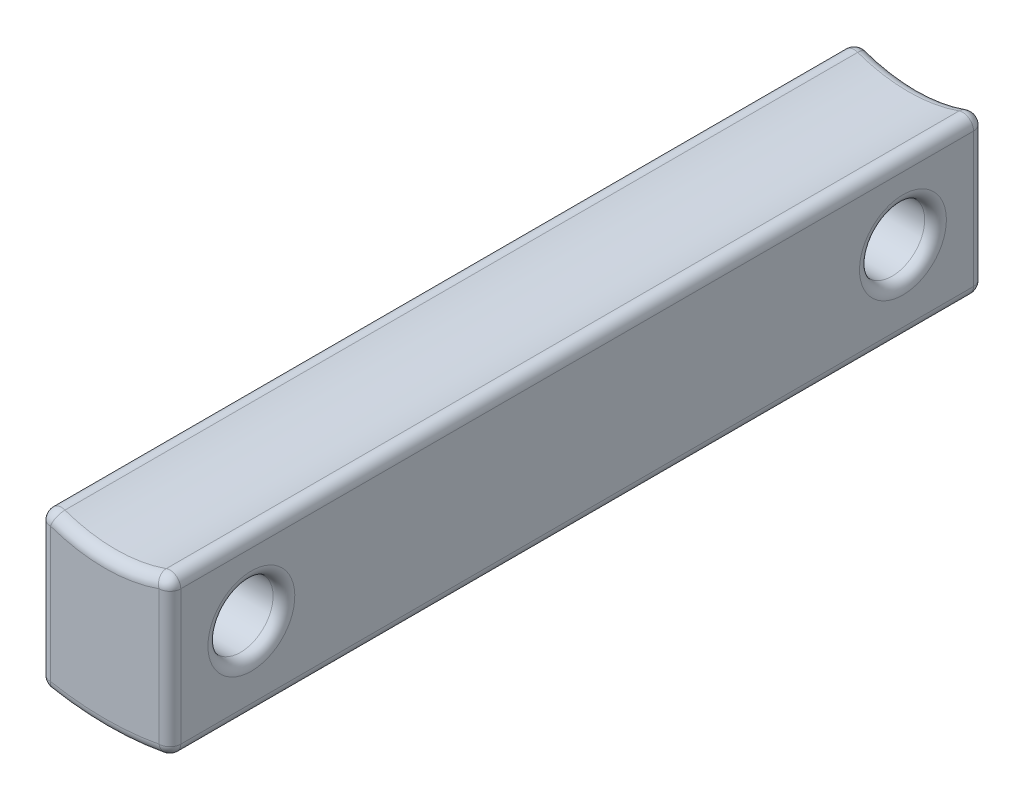
ISO-10303-21;
HEADER;
FILE_DESCRIPTION(('STEP AP214'),'2;1');
FILE_NAME('part.step','',(''),(''),'','','');
FILE_SCHEMA(('AUTOMOTIVE_DESIGN { 1 0 10303 214 1 1 1 1 }'));
ENDSEC;
DATA;
#1=APPLICATION_CONTEXT('core data for automotive mechanical design processes');
#2=APPLICATION_PROTOCOL_DEFINITION('international standard','automotive_design',2000,#1);
#3=PRODUCT_CONTEXT('',#1,'mechanical');
#4=PRODUCT('Part','Part','',(#3));
#5=PRODUCT_RELATED_PRODUCT_CATEGORY('part','',(#4));
#6=PRODUCT_DEFINITION_FORMATION('','',#4);
#7=PRODUCT_DEFINITION_CONTEXT('part definition',#1,'design');
#8=PRODUCT_DEFINITION('design','',#6,#7);
#9=PRODUCT_DEFINITION_SHAPE('','',#8);
#10=(LENGTH_UNIT() NAMED_UNIT(*) SI_UNIT(.MILLI.,.METRE.));
#11=(NAMED_UNIT(*) PLANE_ANGLE_UNIT() SI_UNIT($,.RADIAN.));
#12=(NAMED_UNIT(*) SI_UNIT($,.STERADIAN.) SOLID_ANGLE_UNIT());
#13=UNCERTAINTY_MEASURE_WITH_UNIT(LENGTH_MEASURE(1.E-05),#10,'distance_accuracy_value','');
#14=(GEOMETRIC_REPRESENTATION_CONTEXT(3) GLOBAL_UNCERTAINTY_ASSIGNED_CONTEXT((#13)) GLOBAL_UNIT_ASSIGNED_CONTEXT((#10,
#11,#12)) REPRESENTATION_CONTEXT('',''));
#15=CARTESIAN_POINT('',(0.,0.,0.));
#16=DIRECTION('',(0.,0.,1.));
#17=DIRECTION('',(1.,0.,0.));
#18=AXIS2_PLACEMENT_3D('',#15,#16,#17);
#19=CARTESIAN_POINT('',(-7.74395898966472,15.9123081045218,37.5));
#20=DIRECTION('',(0.,0.,-1.));
#21=DIRECTION('',(-1.,0.,0.));
#22=AXIS2_PLACEMENT_3D('',#19,#20,#21);
#23=CYLINDRICAL_SURFACE('',#22,14.);
#24=CARTESIAN_POINT('',(-7.74395898966472,15.9123081045218,36.5));
#25=DIRECTION('',(0.,0.,1.));
#26=DIRECTION('',(1.,0.,0.));
#27=AXIS2_PLACEMENT_3D('',#24,#25,#26);
#28=CIRCLE('',#27,14.);
#29=CARTESIAN_POINT('',(-12.4106256563314,2.71298152237291,36.5));
#30=VERTEX_POINT('',#29);
#31=CARTESIAN_POINT('',(-3.07729232299805,2.71298152237291,36.5));
#32=VERTEX_POINT('',#31);
#33=EDGE_CURVE('E49',#30,#32,#28,.T.);
#34=ORIENTED_EDGE('',*,*,#33,.T.);
#35=DIRECTION('',(0.,0.,-1.));
#36=VECTOR('',#35,1.);
#37=CARTESIAN_POINT('',(-3.07729232299805,2.71298152237291,37.5));
#38=LINE('',#37,#36);
#39=CARTESIAN_POINT('',(-3.07729232299805,2.71298152237291,-36.5));
#40=VERTEX_POINT('',#39);
#41=EDGE_CURVE('E11',#32,#40,#38,.T.);
#42=ORIENTED_EDGE('',*,*,#41,.T.);
#43=CARTESIAN_POINT('',(-7.74395898966472,15.9123081045218,-36.5));
#44=DIRECTION('',(0.,0.,1.));
#45=DIRECTION('',(1.,0.,0.));
#46=AXIS2_PLACEMENT_3D('',#43,#44,#45);
#47=CIRCLE('',#46,14.);
#48=CARTESIAN_POINT('',(-12.4106256563314,2.71298152237291,-36.5));
#49=VERTEX_POINT('',#48);
#50=EDGE_CURVE('E247',#40,#49,#47,.F.);
#51=ORIENTED_EDGE('',*,*,#50,.T.);
#52=DIRECTION('',(0.,0.,-1.));
#53=VECTOR('',#52,1.);
#54=CARTESIAN_POINT('',(-12.4106256563314,2.71298152237291,37.5));
#55=LINE('',#54,#53);
#56=EDGE_CURVE('E60',#49,#30,#55,.F.);
#57=ORIENTED_EDGE('',*,*,#56,.T.);
#58=EDGE_LOOP('',(#34,#42,#51,#57));
#59=FACE_BOUND('',#58,.T.);
#60=ADVANCED_FACE('F39',(#59),#23,.F.);
#61=CARTESIAN_POINT('',(-13.7439589896647,3.26319746384829,37.5));
#62=DIRECTION('',(1.,0.,0.));
#63=DIRECTION('',(0.,0.,-1.));
#64=AXIS2_PLACEMENT_3D('',#61,#62,#63);
#65=PLANE('',#64);
#66=DIRECTION('',(0.,-1.,0.));
#67=VECTOR('',#66,1.);
#68=CARTESIAN_POINT('',(-13.7439589896647,3.26319746384829,-36.5));
#69=LINE('',#68,#67);
#70=CARTESIAN_POINT('',(-13.7439589896647,1.77017248079085,-36.5));
#71=VERTEX_POINT('',#70);
#72=CARTESIAN_POINT('',(-13.7439589896647,-10.6206902183214,-36.5));
#73=VERTEX_POINT('',#72);
#74=EDGE_CURVE('E184',#71,#73,#69,.T.);
#75=ORIENTED_EDGE('',*,*,#74,.T.);
#76=DIRECTION('',(0.,0.,-1.));
#77=VECTOR('',#76,1.);
#78=CARTESIAN_POINT('',(-13.7439589896647,-10.6206902183214,37.5));
#79=LINE('',#78,#77);
#80=CARTESIAN_POINT('',(-13.7439589896647,-10.6206902183214,36.5));
#81=VERTEX_POINT('',#80);
#82=EDGE_CURVE('E191',#73,#81,#79,.F.);
#83=ORIENTED_EDGE('',*,*,#82,.T.);
#84=DIRECTION('',(0.,-1.,0.));
#85=VECTOR('',#84,1.);
#86=CARTESIAN_POINT('',(-13.7439589896647,3.26319746384829,36.5));
#87=LINE('',#86,#85);
#88=CARTESIAN_POINT('',(-13.7439589896647,1.77017248079085,36.5));
#89=VERTEX_POINT('',#88);
#90=EDGE_CURVE('E187',#81,#89,#87,.F.);
#91=ORIENTED_EDGE('',*,*,#90,.T.);
#92=DIRECTION('',(0.,0.,-1.));
#93=VECTOR('',#92,1.);
#94=CARTESIAN_POINT('',(-13.7439589896647,1.77017248079085,37.5));
#95=LINE('',#94,#93);
#96=EDGE_CURVE('E181',#89,#71,#95,.T.);
#97=ORIENTED_EDGE('',*,*,#96,.T.);
#98=EDGE_LOOP('',(#75,#83,#91,#97));
#99=FACE_BOUND('',#98,.T.);
#100=CARTESIAN_POINT('',(-13.7439589896647,-4.05206194308302,30.));
#101=DIRECTION('',(-1.,0.,0.));
#102=DIRECTION('',(0.,0.,1.));
#103=AXIS2_PLACEMENT_3D('',#100,#101,#102);
#104=CIRCLE('',#103,3.);
#105=CARTESIAN_POINT('',(-13.7439589896647,-4.05206194308302,33.));
#106=VERTEX_POINT('',#105);
#107=EDGE_CURVE('E169',#106,#106,#104,.T.);
#108=ORIENTED_EDGE('',*,*,#107,.F.);
#109=EDGE_LOOP('',(#108));
#110=FACE_BOUND('',#109,.T.);
#111=CARTESIAN_POINT('',(-13.7439589896647,-4.05206194308303,-30.));
#112=DIRECTION('',(-1.,0.,0.));
#113=DIRECTION('',(0.,0.,1.));
#114=AXIS2_PLACEMENT_3D('',#111,#112,#113);
#115=CIRCLE('',#114,3.);
#116=CARTESIAN_POINT('',(-13.7439589896647,-4.05206194308303,-27.));
#117=VERTEX_POINT('',#116);
#118=EDGE_CURVE('E173',#117,#117,#115,.T.);
#119=ORIENTED_EDGE('',*,*,#118,.F.);
#120=EDGE_LOOP('',(#119));
#121=FACE_BOUND('',#120,.T.);
#122=ADVANCED_FACE('F339',(#99,#110,#121),#65,.F.);
#123=CARTESIAN_POINT('',(-7.74395898966471,15.9123081045218,37.5));
#124=DIRECTION('',(0.,0.,-1.));
#125=DIRECTION('',(-1.,0.,0.));
#126=AXIS2_PLACEMENT_3D('',#123,#124,#125);
#127=CYLINDRICAL_SURFACE('',#126,28.);
#128=CARTESIAN_POINT('',(-7.74395898966471,15.9123081045218,36.5));
#129=DIRECTION('',(0.,0.,1.));
#130=DIRECTION('',(1.,0.,0.));
#131=AXIS2_PLACEMENT_3D('',#128,#129,#130);
#132=CIRCLE('',#131,28.);
#133=CARTESIAN_POINT('',(-2.55877380447953,-11.6033938599082,36.5));
#134=VERTEX_POINT('',#133);
#135=CARTESIAN_POINT('',(-12.9291441748499,-11.6033938599082,36.5));
#136=VERTEX_POINT('',#135);
#137=EDGE_CURVE('E240',#134,#136,#132,.F.);
#138=ORIENTED_EDGE('',*,*,#137,.T.);
#139=DIRECTION('',(0.,0.,-1.));
#140=VECTOR('',#139,1.);
#141=CARTESIAN_POINT('',(-12.9291441748499,-11.6033938599082,37.5));
#142=LINE('',#141,#140);
#143=CARTESIAN_POINT('',(-12.9291441748499,-11.6033938599082,-36.5));
#144=VERTEX_POINT('',#143);
#145=EDGE_CURVE('E243',#136,#144,#142,.T.);
#146=ORIENTED_EDGE('',*,*,#145,.T.);
#147=CARTESIAN_POINT('',(-7.74395898966471,15.9123081045218,-36.5));
#148=DIRECTION('',(0.,0.,1.));
#149=DIRECTION('',(1.,0.,0.));
#150=AXIS2_PLACEMENT_3D('',#147,#148,#149);
#151=CIRCLE('',#150,28.);
#152=CARTESIAN_POINT('',(-2.55877380447953,-11.6033938599082,-36.5));
#153=VERTEX_POINT('',#152);
#154=EDGE_CURVE('E234',#144,#153,#151,.T.);
#155=ORIENTED_EDGE('',*,*,#154,.T.);
#156=DIRECTION('',(0.,0.,-1.));
#157=VECTOR('',#156,1.);
#158=CARTESIAN_POINT('',(-2.55877380447953,-11.6033938599082,37.5));
#159=LINE('',#158,#157);
#160=EDGE_CURVE('E237',#153,#134,#159,.F.);
#161=ORIENTED_EDGE('',*,*,#160,.T.);
#162=EDGE_LOOP('',(#138,#146,#155,#161));
#163=FACE_BOUND('',#162,.T.);
#164=ADVANCED_FACE('F341',(#163),#127,.T.);
#165=CARTESIAN_POINT('',(-1.74395898966472,-11.4372805578329,37.5));
#166=DIRECTION('',(-1.,0.,0.));
#167=DIRECTION('',(0.,-1.,0.));
#168=AXIS2_PLACEMENT_3D('',#165,#166,#167);
#169=PLANE('',#168);
#170=CARTESIAN_POINT('',(-1.74395898966472,-4.05206194308303,-30.));
#171=DIRECTION('',(-1.,0.,0.));
#172=DIRECTION('',(0.,-1.,0.));
#173=AXIS2_PLACEMENT_3D('',#170,#171,#172);
#174=CIRCLE('',#173,4.);
#175=CARTESIAN_POINT('',(-1.74395898966472,-8.05206194308303,-30.));
#176=VERTEX_POINT('',#175);
#177=EDGE_CURVE('E209',#176,#176,#174,.T.);
#178=ORIENTED_EDGE('',*,*,#177,.T.);
#179=EDGE_LOOP('',(#178));
#180=FACE_BOUND('',#179,.T.);
#181=CARTESIAN_POINT('',(-1.74395898966472,-4.05206194308302,30.));
#182=DIRECTION('',(-1.,0.,0.));
#183=DIRECTION('',(0.,-1.,0.));
#184=AXIS2_PLACEMENT_3D('',#181,#182,#183);
#185=CIRCLE('',#184,4.);
#186=CARTESIAN_POINT('',(-1.74395898966472,-8.05206194308302,30.));
#187=VERTEX_POINT('',#186);
#188=EDGE_CURVE('E205',#187,#187,#185,.T.);
#189=ORIENTED_EDGE('',*,*,#188,.T.);
#190=EDGE_LOOP('',(#189));
#191=FACE_BOUND('',#190,.T.);
#192=DIRECTION('',(0.,1.,0.));
#193=VECTOR('',#192,1.);
#194=CARTESIAN_POINT('',(-1.74395898966472,-11.4372805578329,36.5));
#195=LINE('',#194,#193);
#196=CARTESIAN_POINT('',(-1.74395898966472,1.77017248079085,36.5));
#197=VERTEX_POINT('',#196);
#198=CARTESIAN_POINT('',(-1.74395898966472,-10.6206902183214,36.5));
#199=VERTEX_POINT('',#198);
#200=EDGE_CURVE('E148',#197,#199,#195,.F.);
#201=ORIENTED_EDGE('',*,*,#200,.T.);
#202=DIRECTION('',(0.,0.,-1.));
#203=VECTOR('',#202,1.);
#204=CARTESIAN_POINT('',(-1.74395898966472,-10.6206902183214,37.5));
#205=LINE('',#204,#203);
#206=CARTESIAN_POINT('',(-1.74395898966472,-10.6206902183214,-36.5));
#207=VERTEX_POINT('',#206);
#208=EDGE_CURVE('E202',#199,#207,#205,.T.);
#209=ORIENTED_EDGE('',*,*,#208,.T.);
#210=DIRECTION('',(0.,1.,0.));
#211=VECTOR('',#210,1.);
#212=CARTESIAN_POINT('',(-1.74395898966472,-11.4372805578329,-36.5));
#213=LINE('',#212,#211);
#214=CARTESIAN_POINT('',(-1.74395898966472,1.77017248079085,-36.5));
#215=VERTEX_POINT('',#214);
#216=EDGE_CURVE('E197',#207,#215,#213,.T.);
#217=ORIENTED_EDGE('',*,*,#216,.T.);
#218=DIRECTION('',(0.,0.,-1.));
#219=VECTOR('',#218,1.);
#220=CARTESIAN_POINT('',(-1.74395898966472,1.77017248079084,37.5));
#221=LINE('',#220,#219);
#222=EDGE_CURVE('E194',#215,#197,#221,.F.);
#223=ORIENTED_EDGE('',*,*,#222,.T.);
#224=EDGE_LOOP('',(#201,#209,#217,#223));
#225=FACE_BOUND('',#224,.T.);
#226=ADVANCED_FACE('F348',(#180,#191,#225),#169,.F.);
#227=CARTESIAN_POINT('',(-7.74395898966472,15.9123081045218,37.5));
#228=DIRECTION('',(0.,0.,1.));
#229=DIRECTION('',(1.,0.,0.));
#230=AXIS2_PLACEMENT_3D('',#227,#228,#229);
#231=PLANE('',#230);
#232=DIRECTION('',(0.,-1.,0.));
#233=VECTOR('',#232,1.);
#234=CARTESIAN_POINT('',(-12.7439589896647,-11.4372805578329,37.5));
#235=LINE('',#234,#233);
#236=CARTESIAN_POINT('',(-12.7439589896647,1.77017248079085,37.5));
#237=VERTEX_POINT('',#236);
#238=CARTESIAN_POINT('',(-12.7439589896647,-10.6206902183214,37.5));
#239=VERTEX_POINT('',#238);
#240=EDGE_CURVE('E140',#237,#239,#235,.T.);
#241=ORIENTED_EDGE('',*,*,#240,.T.);
#242=CARTESIAN_POINT('',(-7.74395898966471,15.9123081045218,37.5));
#243=DIRECTION('',(0.,0.,1.));
#244=DIRECTION('',(1.,0.,0.));
#245=AXIS2_PLACEMENT_3D('',#242,#243,#244);
#246=CIRCLE('',#245,27.);
#247=CARTESIAN_POINT('',(-2.74395898966472,-10.6206902183214,37.5));
#248=VERTEX_POINT('',#247);
#249=EDGE_CURVE('E135',#239,#248,#246,.T.);
#250=ORIENTED_EDGE('',*,*,#249,.T.);
#251=DIRECTION('',(0.,1.,0.));
#252=VECTOR('',#251,1.);
#253=CARTESIAN_POINT('',(-2.74395898966472,3.26319746384827,37.5));
#254=LINE('',#253,#252);
#255=CARTESIAN_POINT('',(-2.74395898966472,1.77017248079084,37.5));
#256=VERTEX_POINT('',#255);
#257=EDGE_CURVE('E127',#248,#256,#254,.T.);
#258=ORIENTED_EDGE('',*,*,#257,.T.);
#259=CARTESIAN_POINT('',(-7.74395898966472,15.9123081045218,37.5));
#260=DIRECTION('',(0.,0.,1.));
#261=DIRECTION('',(1.,0.,0.));
#262=AXIS2_PLACEMENT_3D('',#259,#260,#261);
#263=CIRCLE('',#262,15.);
#264=EDGE_CURVE('E132',#256,#237,#263,.F.);
#265=ORIENTED_EDGE('',*,*,#264,.T.);
#266=EDGE_LOOP('',(#241,#250,#258,#265));
#267=FACE_BOUND('',#266,.T.);
#268=ADVANCED_FACE('F130',(#267),#231,.T.);
#269=CARTESIAN_POINT('',(-7.74395898966472,15.9123081045218,-37.5));
#270=DIRECTION('',(0.,0.,1.));
#271=DIRECTION('',(1.,0.,0.));
#272=AXIS2_PLACEMENT_3D('',#269,#270,#271);
#273=PLANE('',#272);
#274=DIRECTION('',(0.,1.,0.));
#275=VECTOR('',#274,1.);
#276=CARTESIAN_POINT('',(-2.74395898966472,15.9123081045218,-37.5));
#277=LINE('',#276,#275);
#278=CARTESIAN_POINT('',(-2.74395898966472,1.77017248079084,-37.5));
#279=VERTEX_POINT('',#278);
#280=CARTESIAN_POINT('',(-2.74395898966472,-10.6206902183214,-37.5));
#281=VERTEX_POINT('',#280);
#282=EDGE_CURVE('E224',#279,#281,#277,.F.);
#283=ORIENTED_EDGE('',*,*,#282,.T.);
#284=CARTESIAN_POINT('',(-7.74395898966471,15.9123081045218,-37.5));
#285=DIRECTION('',(0.,0.,1.));
#286=DIRECTION('',(1.,0.,0.));
#287=AXIS2_PLACEMENT_3D('',#284,#285,#286);
#288=CIRCLE('',#287,27.);
#289=CARTESIAN_POINT('',(-12.7439589896647,-10.6206902183214,-37.5));
#290=VERTEX_POINT('',#289);
#291=EDGE_CURVE('E231',#281,#290,#288,.F.);
#292=ORIENTED_EDGE('',*,*,#291,.T.);
#293=DIRECTION('',(0.,-1.,0.));
#294=VECTOR('',#293,1.);
#295=CARTESIAN_POINT('',(-12.7439589896647,15.9123081045218,-37.5));
#296=LINE('',#295,#294);
#297=CARTESIAN_POINT('',(-12.7439589896647,1.77017248079085,-37.5));
#298=VERTEX_POINT('',#297);
#299=EDGE_CURVE('E227',#290,#298,#296,.F.);
#300=ORIENTED_EDGE('',*,*,#299,.T.);
#301=CARTESIAN_POINT('',(-7.74395898966472,15.9123081045218,-37.5));
#302=DIRECTION('',(0.,0.,1.));
#303=DIRECTION('',(1.,0.,0.));
#304=AXIS2_PLACEMENT_3D('',#301,#302,#303);
#305=CIRCLE('',#304,15.);
#306=EDGE_CURVE('E221',#298,#279,#305,.T.);
#307=ORIENTED_EDGE('',*,*,#306,.T.);
#308=EDGE_LOOP('',(#283,#292,#300,#307));
#309=FACE_BOUND('',#308,.T.);
#310=ADVANCED_FACE('F465',(#309),#273,.F.);
#311=CARTESIAN_POINT('',(-1.74395898966472,-4.05206194308303,-30.));
#312=DIRECTION('',(-1.,0.,0.));
#313=DIRECTION('',(0.,0.,1.));
#314=AXIS2_PLACEMENT_3D('',#311,#312,#313);
#315=CYLINDRICAL_SURFACE('',#314,3.);
#316=CARTESIAN_POINT('',(-2.74395898966472,-4.05206194308303,-30.));
#317=DIRECTION('',(-1.,0.,0.));
#318=DIRECTION('',(0.,-1.,0.));
#319=AXIS2_PLACEMENT_3D('',#316,#317,#318);
#320=CIRCLE('',#319,3.);
#321=CARTESIAN_POINT('',(-2.74395898966472,-7.05206194308303,-30.));
#322=VERTEX_POINT('',#321);
#323=EDGE_CURVE('E213',#322,#322,#320,.F.);
#324=ORIENTED_EDGE('',*,*,#323,.T.);
#325=EDGE_LOOP('',(#324));
#326=FACE_BOUND('',#325,.T.);
#327=ORIENTED_EDGE('',*,*,#118,.T.);
#328=EDGE_LOOP('',(#327));
#329=FACE_BOUND('',#328,.T.);
#330=ADVANCED_FACE('F337',(#326,#329),#315,.F.);
#331=CARTESIAN_POINT('',(-1.74395898966472,-4.05206194308302,30.));
#332=DIRECTION('',(-1.,0.,0.));
#333=DIRECTION('',(0.,0.,1.));
#334=AXIS2_PLACEMENT_3D('',#331,#332,#333);
#335=CYLINDRICAL_SURFACE('',#334,3.);
#336=CARTESIAN_POINT('',(-2.74395898966472,-4.05206194308302,30.));
#337=DIRECTION('',(-1.,0.,0.));
#338=DIRECTION('',(0.,-1.,0.));
#339=AXIS2_PLACEMENT_3D('',#336,#337,#338);
#340=CIRCLE('',#339,3.);
#341=CARTESIAN_POINT('',(-2.74395898966472,-7.05206194308302,30.));
#342=VERTEX_POINT('',#341);
#343=EDGE_CURVE('E217',#342,#342,#340,.F.);
#344=ORIENTED_EDGE('',*,*,#343,.T.);
#345=EDGE_LOOP('',(#344));
#346=FACE_BOUND('',#345,.T.);
#347=ORIENTED_EDGE('',*,*,#107,.T.);
#348=EDGE_LOOP('',(#347));
#349=FACE_BOUND('',#348,.T.);
#350=ADVANCED_FACE('F426',(#346,#349),#335,.F.);
#351=CARTESIAN_POINT('',(-2.74395898966472,-11.4372805578329,-36.5));
#352=DIRECTION('',(0.,1.,0.));
#353=DIRECTION('',(-1.,0.,0.));
#354=AXIS2_PLACEMENT_3D('',#351,#352,#353);
#355=CYLINDRICAL_SURFACE('',#354,1.);
#356=CARTESIAN_POINT('',(-2.74395898966472,1.77017248079084,-36.5));
#357=DIRECTION('',(0.,1.,0.));
#358=DIRECTION('',(0.,0.,1.));
#359=AXIS2_PLACEMENT_3D('',#356,#357,#358);
#360=CIRCLE('',#359,1.);
#361=EDGE_CURVE('E43',#215,#279,#360,.T.);
#362=ORIENTED_EDGE('',*,*,#361,.F.);
#363=ORIENTED_EDGE('',*,*,#216,.F.);
#364=CARTESIAN_POINT('',(-2.74395898966472,-10.6206902183214,-36.5));
#365=DIRECTION('',(0.,-1.,0.));
#366=DIRECTION('',(1.,0.,0.));
#367=AXIS2_PLACEMENT_3D('',#364,#365,#366);
#368=CIRCLE('',#367,1.);
#369=EDGE_CURVE('E320',#281,#207,#368,.T.);
#370=ORIENTED_EDGE('',*,*,#369,.F.);
#371=ORIENTED_EDGE('',*,*,#282,.F.);
#372=EDGE_LOOP('',(#362,#363,#370,#371));
#373=FACE_BOUND('',#372,.T.);
#374=ADVANCED_FACE('F424',(#373),#355,.T.);
#375=CARTESIAN_POINT('',(-2.74395898966472,1.77017248079084,-36.5));
#376=DIRECTION('',(0.,0.,1.));
#377=DIRECTION('',(1.,0.,0.));
#378=AXIS2_PLACEMENT_3D('',#375,#376,#377);
#379=SPHERICAL_SURFACE('',#378,1.);
#380=CARTESIAN_POINT('',(-2.74395898966472,1.77017248079084,-36.5));
#381=DIRECTION('',(0.,0.,-1.));
#382=DIRECTION('',(-1.,0.,0.));
#383=AXIS2_PLACEMENT_3D('',#380,#381,#382);
#384=CIRCLE('',#383,1.);
#385=EDGE_CURVE('E313',#215,#40,#384,.F.);
#386=ORIENTED_EDGE('',*,*,#385,.F.);
#387=ORIENTED_EDGE('',*,*,#361,.T.);
#388=CARTESIAN_POINT('',(-2.74395898966472,1.77017248079084,-36.5));
#389=DIRECTION('',(0.942809041582063,0.333333333333334,0.));
#390=DIRECTION('',(-0.333333333333334,0.942809041582063,0.));
#391=AXIS2_PLACEMENT_3D('',#388,#389,#390);
#392=CIRCLE('',#391,1.);
#393=EDGE_CURVE('E317',#40,#279,#392,.F.);
#394=ORIENTED_EDGE('',*,*,#393,.F.);
#395=EDGE_LOOP('',(#386,#387,#394));
#396=FACE_BOUND('',#395,.T.);
#397=ADVANCED_FACE('F421',(#396),#379,.T.);
#398=CARTESIAN_POINT('',(-2.74395898966472,-10.6206902183214,-36.5));
#399=DIRECTION('',(0.,0.,1.));
#400=DIRECTION('',(1.,0.,0.));
#401=AXIS2_PLACEMENT_3D('',#398,#399,#400);
#402=SPHERICAL_SURFACE('',#401,1.);
#403=CARTESIAN_POINT('',(-2.74395898966472,-10.6206902183214,-36.5));
#404=DIRECTION('',(0.982703641586785,0.185185185185185,0.));
#405=DIRECTION('',(-0.185185185185185,0.982703641586785,0.));
#406=AXIS2_PLACEMENT_3D('',#403,#404,#405);
#407=CIRCLE('',#406,1.);
#408=EDGE_CURVE('E305',#281,#153,#407,.F.);
#409=ORIENTED_EDGE('',*,*,#408,.F.);
#410=ORIENTED_EDGE('',*,*,#369,.T.);
#411=CARTESIAN_POINT('',(-2.74395898966472,-10.6206902183214,-36.5));
#412=DIRECTION('',(0.,0.,-1.));
#413=DIRECTION('',(-1.,0.,0.));
#414=AXIS2_PLACEMENT_3D('',#411,#412,#413);
#415=CIRCLE('',#414,1.);
#416=EDGE_CURVE('E309',#153,#207,#415,.F.);
#417=ORIENTED_EDGE('',*,*,#416,.F.);
#418=EDGE_LOOP('',(#409,#410,#417));
#419=FACE_BOUND('',#418,.T.);
#420=ADVANCED_FACE('F417',(#419),#402,.T.);
#421=CARTESIAN_POINT('',(-7.74395898966472,15.9123081045218,-36.5));
#422=DIRECTION('',(0.,0.,1.));
#423=DIRECTION('',(1.,0.,0.));
#424=AXIS2_PLACEMENT_3D('',#421,#422,#423);
#425=TOROIDAL_SURFACE('',#424,15.,1.);
#426=ORIENTED_EDGE('',*,*,#393,.T.);
#427=ORIENTED_EDGE('',*,*,#306,.F.);
#428=CARTESIAN_POINT('',(-12.7439589896647,1.77017248079085,-36.5));
#429=DIRECTION('',(-0.942809041582063,0.333333333333333,0.));
#430=DIRECTION('',(-0.333333333333333,-0.942809041582063,0.));
#431=AXIS2_PLACEMENT_3D('',#428,#429,#430);
#432=CIRCLE('',#431,1.);
#433=EDGE_CURVE('E298',#49,#298,#432,.T.);
#434=ORIENTED_EDGE('',*,*,#433,.F.);
#435=ORIENTED_EDGE('',*,*,#50,.F.);
#436=EDGE_LOOP('',(#426,#427,#434,#435));
#437=FACE_BOUND('',#436,.T.);
#438=ADVANCED_FACE('F413',(#437),#425,.T.);
#439=CARTESIAN_POINT('',(-2.74395898966472,1.77017248079084,37.5));
#440=DIRECTION('',(0.,0.,-1.));
#441=DIRECTION('',(-1.,0.,0.));
#442=AXIS2_PLACEMENT_3D('',#439,#440,#441);
#443=CYLINDRICAL_SURFACE('',#442,1.);
#444=ORIENTED_EDGE('',*,*,#385,.T.);
#445=ORIENTED_EDGE('',*,*,#41,.F.);
#446=CARTESIAN_POINT('',(-2.74395898966472,1.77017248079084,36.5));
#447=DIRECTION('',(0.,0.,1.));
#448=DIRECTION('',(1.,0.,0.));
#449=AXIS2_PLACEMENT_3D('',#446,#447,#448);
#450=CIRCLE('',#449,1.);
#451=EDGE_CURVE('E153',#197,#32,#450,.T.);
#452=ORIENTED_EDGE('',*,*,#451,.F.);
#453=ORIENTED_EDGE('',*,*,#222,.F.);
#454=EDGE_LOOP('',(#444,#445,#452,#453));
#455=FACE_BOUND('',#454,.T.);
#456=ADVANCED_FACE('F410',(#455),#443,.T.);
#457=CARTESIAN_POINT('',(-2.74395898966472,15.9123081045218,36.5));
#458=DIRECTION('',(0.,-1.,0.));
#459=DIRECTION('',(1.,0.,0.));
#460=AXIS2_PLACEMENT_3D('',#457,#458,#459);
#461=CYLINDRICAL_SURFACE('',#460,1.);
#462=CARTESIAN_POINT('',(-2.74395898966472,-10.6206902183214,36.5));
#463=DIRECTION('',(0.,-1.,0.));
#464=DIRECTION('',(0.,0.,-1.));
#465=AXIS2_PLACEMENT_3D('',#462,#463,#464);
#466=CIRCLE('',#465,1.);
#467=EDGE_CURVE('E154',#199,#248,#466,.T.);
#468=ORIENTED_EDGE('',*,*,#467,.F.);
#469=ORIENTED_EDGE('',*,*,#200,.F.);
#470=CARTESIAN_POINT('',(-2.74395898966472,1.77017248079085,36.5));
#471=DIRECTION('',(0.,1.,0.));
#472=DIRECTION('',(-1.,0.,0.));
#473=AXIS2_PLACEMENT_3D('',#470,#471,#472);
#474=CIRCLE('',#473,1.);
#475=EDGE_CURVE('E144',#256,#197,#474,.T.);
#476=ORIENTED_EDGE('',*,*,#475,.F.);
#477=ORIENTED_EDGE('',*,*,#257,.F.);
#478=EDGE_LOOP('',(#468,#469,#476,#477));
#479=FACE_BOUND('',#478,.T.);
#480=ADVANCED_FACE('F146',(#479),#461,.T.);
#481=CARTESIAN_POINT('',(-2.74395898966472,-10.6206902183214,37.5));
#482=DIRECTION('',(0.,0.,-1.));
#483=DIRECTION('',(-1.,0.,0.));
#484=AXIS2_PLACEMENT_3D('',#481,#482,#483);
#485=CYLINDRICAL_SURFACE('',#484,1.);
#486=ORIENTED_EDGE('',*,*,#416,.T.);
#487=ORIENTED_EDGE('',*,*,#208,.F.);
#488=CARTESIAN_POINT('',(-2.74395898966472,-10.6206902183214,36.5));
#489=DIRECTION('',(0.,0.,1.));
#490=DIRECTION('',(1.,0.,0.));
#491=AXIS2_PLACEMENT_3D('',#488,#489,#490);
#492=CIRCLE('',#491,1.);
#493=EDGE_CURVE('E291',#134,#199,#492,.T.);
#494=ORIENTED_EDGE('',*,*,#493,.F.);
#495=ORIENTED_EDGE('',*,*,#160,.F.);
#496=EDGE_LOOP('',(#486,#487,#494,#495));
#497=FACE_BOUND('',#496,.T.);
#498=ADVANCED_FACE('F403',(#497),#485,.T.);
#499=CARTESIAN_POINT('',(-7.74395898966471,15.9123081045218,-36.5));
#500=DIRECTION('',(0.,0.,1.));
#501=DIRECTION('',(1.,0.,0.));
#502=AXIS2_PLACEMENT_3D('',#499,#500,#501);
#503=TOROIDAL_SURFACE('',#502,27.,1.);
#504=ORIENTED_EDGE('',*,*,#408,.T.);
#505=ORIENTED_EDGE('',*,*,#154,.F.);
#506=CARTESIAN_POINT('',(-12.7439589896647,-10.6206902183214,-36.5));
#507=DIRECTION('',(-0.982703641586785,0.185185185185184,0.));
#508=DIRECTION('',(-0.185185185185184,-0.982703641586785,0.));
#509=AXIS2_PLACEMENT_3D('',#506,#507,#508);
#510=CIRCLE('',#509,1.);
#511=EDGE_CURVE('E287',#290,#144,#510,.T.);
#512=ORIENTED_EDGE('',*,*,#511,.F.);
#513=ORIENTED_EDGE('',*,*,#291,.F.);
#514=EDGE_LOOP('',(#504,#505,#512,#513));
#515=FACE_BOUND('',#514,.T.);
#516=ADVANCED_FACE('F399',(#515),#503,.T.);
#517=CARTESIAN_POINT('',(-12.7439589896647,3.26319746384829,-36.5));
#518=DIRECTION('',(0.,-1.,0.));
#519=DIRECTION('',(0.,0.,-1.));
#520=AXIS2_PLACEMENT_3D('',#517,#518,#519);
#521=CYLINDRICAL_SURFACE('',#520,1.);
#522=CARTESIAN_POINT('',(-12.7439589896647,1.77017248079085,-36.5));
#523=DIRECTION('',(0.,1.,0.));
#524=DIRECTION('',(-1.,0.,0.));
#525=AXIS2_PLACEMENT_3D('',#522,#523,#524);
#526=CIRCLE('',#525,1.);
#527=EDGE_CURVE('E301',#298,#71,#526,.T.);
#528=ORIENTED_EDGE('',*,*,#527,.F.);
#529=ORIENTED_EDGE('',*,*,#299,.F.);
#530=CARTESIAN_POINT('',(-12.7439589896647,-10.6206902183214,-36.5));
#531=DIRECTION('',(0.,-1.,0.));
#532=DIRECTION('',(0.,0.,-1.));
#533=AXIS2_PLACEMENT_3D('',#530,#531,#532);
#534=CIRCLE('',#533,1.);
#535=EDGE_CURVE('E283',#73,#290,#534,.T.);
#536=ORIENTED_EDGE('',*,*,#535,.F.);
#537=ORIENTED_EDGE('',*,*,#74,.F.);
#538=EDGE_LOOP('',(#528,#529,#536,#537));
#539=FACE_BOUND('',#538,.T.);
#540=ADVANCED_FACE('F395',(#539),#521,.T.);
#541=CARTESIAN_POINT('',(-12.7439589896647,1.77017248079085,-36.5));
#542=DIRECTION('',(0.,0.,1.));
#543=DIRECTION('',(1.,0.,0.));
#544=AXIS2_PLACEMENT_3D('',#541,#542,#543);
#545=SPHERICAL_SURFACE('',#544,1.);
#546=ORIENTED_EDGE('',*,*,#433,.T.);
#547=ORIENTED_EDGE('',*,*,#527,.T.);
#548=CARTESIAN_POINT('',(-12.7439589896647,1.77017248079085,-36.5));
#549=DIRECTION('',(0.,0.,-1.));
#550=DIRECTION('',(-1.,0.,0.));
#551=AXIS2_PLACEMENT_3D('',#548,#549,#550);
#552=CIRCLE('',#551,1.);
#553=EDGE_CURVE('E161',#49,#71,#552,.F.);
#554=ORIENTED_EDGE('',*,*,#553,.F.);
#555=EDGE_LOOP('',(#546,#547,#554));
#556=FACE_BOUND('',#555,.T.);
#557=ADVANCED_FACE('F392',(#556),#545,.T.);
#558=CARTESIAN_POINT('',(-2.74395898966472,1.77017248079085,36.5));
#559=DIRECTION('',(0.,0.,1.));
#560=DIRECTION('',(1.,0.,0.));
#561=AXIS2_PLACEMENT_3D('',#558,#559,#560);
#562=SPHERICAL_SURFACE('',#561,1.);
#563=ORIENTED_EDGE('',*,*,#475,.T.);
#564=ORIENTED_EDGE('',*,*,#451,.T.);
#565=CARTESIAN_POINT('',(-2.74395898966472,1.77017248079084,36.5));
#566=DIRECTION('',(0.942809041582063,0.333333333333333,0.));
#567=DIRECTION('',(-0.333333333333333,0.942809041582063,0.));
#568=AXIS2_PLACEMENT_3D('',#565,#566,#567);
#569=CIRCLE('',#568,1.);
#570=EDGE_CURVE('E157',#256,#32,#569,.F.);
#571=ORIENTED_EDGE('',*,*,#570,.F.);
#572=EDGE_LOOP('',(#563,#564,#571));
#573=FACE_BOUND('',#572,.T.);
#574=ADVANCED_FACE('F158',(#573),#562,.T.);
#575=CARTESIAN_POINT('',(-2.74395898966472,-10.6206902183214,36.5));
#576=DIRECTION('',(0.,0.,1.));
#577=DIRECTION('',(1.,0.,0.));
#578=AXIS2_PLACEMENT_3D('',#575,#576,#577);
#579=SPHERICAL_SURFACE('',#578,1.);
#580=ORIENTED_EDGE('',*,*,#493,.T.);
#581=ORIENTED_EDGE('',*,*,#467,.T.);
#582=CARTESIAN_POINT('',(-2.74395898966472,-10.6206902183214,36.5));
#583=DIRECTION('',(0.982703641586785,0.185185185185184,0.));
#584=DIRECTION('',(-0.185185185185184,0.982703641586785,0.));
#585=AXIS2_PLACEMENT_3D('',#582,#583,#584);
#586=CIRCLE('',#585,1.);
#587=EDGE_CURVE('E162',#134,#248,#586,.F.);
#588=ORIENTED_EDGE('',*,*,#587,.F.);
#589=EDGE_LOOP('',(#580,#581,#588));
#590=FACE_BOUND('',#589,.T.);
#591=ADVANCED_FACE('F385',(#590),#579,.T.);
#592=CARTESIAN_POINT('',(-12.7439589896647,-10.6206902183214,-36.5));
#593=DIRECTION('',(0.,0.,1.));
#594=DIRECTION('',(1.,0.,0.));
#595=AXIS2_PLACEMENT_3D('',#592,#593,#594);
#596=SPHERICAL_SURFACE('',#595,1.);
#597=ORIENTED_EDGE('',*,*,#535,.T.);
#598=ORIENTED_EDGE('',*,*,#511,.T.);
#599=CARTESIAN_POINT('',(-12.7439589896647,-10.6206902183214,-36.5));
#600=DIRECTION('',(0.,0.,-1.));
#601=DIRECTION('',(-1.,0.,0.));
#602=AXIS2_PLACEMENT_3D('',#599,#600,#601);
#603=CIRCLE('',#602,1.);
#604=EDGE_CURVE('E274',#73,#144,#603,.F.);
#605=ORIENTED_EDGE('',*,*,#604,.F.);
#606=EDGE_LOOP('',(#597,#598,#605));
#607=FACE_BOUND('',#606,.T.);
#608=ADVANCED_FACE('F381',(#607),#596,.T.);
#609=CARTESIAN_POINT('',(-12.7439589896647,1.77017248079085,37.5));
#610=DIRECTION('',(0.,0.,-1.));
#611=DIRECTION('',(-1.,0.,0.));
#612=AXIS2_PLACEMENT_3D('',#609,#610,#611);
#613=CYLINDRICAL_SURFACE('',#612,1.);
#614=ORIENTED_EDGE('',*,*,#553,.T.);
#615=ORIENTED_EDGE('',*,*,#96,.F.);
#616=CARTESIAN_POINT('',(-12.7439589896647,1.77017248079085,36.5));
#617=DIRECTION('',(0.,0.,1.));
#618=DIRECTION('',(1.,0.,0.));
#619=AXIS2_PLACEMENT_3D('',#616,#617,#618);
#620=CIRCLE('',#619,1.);
#621=EDGE_CURVE('E270',#30,#89,#620,.T.);
#622=ORIENTED_EDGE('',*,*,#621,.F.);
#623=ORIENTED_EDGE('',*,*,#56,.F.);
#624=EDGE_LOOP('',(#614,#615,#622,#623));
#625=FACE_BOUND('',#624,.T.);
#626=ADVANCED_FACE('F378',(#625),#613,.T.);
#627=CARTESIAN_POINT('',(-7.74395898966472,15.9123081045218,36.5));
#628=DIRECTION('',(0.,0.,1.));
#629=DIRECTION('',(1.,0.,0.));
#630=AXIS2_PLACEMENT_3D('',#627,#628,#629);
#631=TOROIDAL_SURFACE('',#630,15.,1.);
#632=ORIENTED_EDGE('',*,*,#570,.T.);
#633=ORIENTED_EDGE('',*,*,#33,.F.);
#634=CARTESIAN_POINT('',(-12.7439589896647,1.77017248079085,36.5));
#635=DIRECTION('',(-0.942809041582063,0.333333333333333,0.));
#636=DIRECTION('',(-0.333333333333334,-0.942809041582063,0.));
#637=AXIS2_PLACEMENT_3D('',#634,#635,#636);
#638=CIRCLE('',#637,1.);
#639=EDGE_CURVE('E166',#237,#30,#638,.T.);
#640=ORIENTED_EDGE('',*,*,#639,.F.);
#641=ORIENTED_EDGE('',*,*,#264,.F.);
#642=EDGE_LOOP('',(#632,#633,#640,#641));
#643=FACE_BOUND('',#642,.T.);
#644=ADVANCED_FACE('F164',(#643),#631,.T.);
#645=CARTESIAN_POINT('',(-7.74395898966471,15.9123081045218,36.5));
#646=DIRECTION('',(0.,0.,1.));
#647=DIRECTION('',(1.,0.,0.));
#648=AXIS2_PLACEMENT_3D('',#645,#646,#647);
#649=TOROIDAL_SURFACE('',#648,27.,1.);
#650=ORIENTED_EDGE('',*,*,#587,.T.);
#651=ORIENTED_EDGE('',*,*,#249,.F.);
#652=CARTESIAN_POINT('',(-12.7439589896647,-10.6206902183214,36.5));
#653=DIRECTION('',(-0.982703641586785,0.185185185185186,0.));
#654=DIRECTION('',(-0.185185185185186,-0.982703641586785,0.));
#655=AXIS2_PLACEMENT_3D('',#652,#653,#654);
#656=CIRCLE('',#655,1.);
#657=EDGE_CURVE('E264',#136,#239,#656,.T.);
#658=ORIENTED_EDGE('',*,*,#657,.F.);
#659=ORIENTED_EDGE('',*,*,#137,.F.);
#660=EDGE_LOOP('',(#650,#651,#658,#659));
#661=FACE_BOUND('',#660,.T.);
#662=ADVANCED_FACE('F371',(#661),#649,.T.);
#663=CARTESIAN_POINT('',(-12.7439589896647,-10.6206902183214,37.5));
#664=DIRECTION('',(0.,0.,-1.));
#665=DIRECTION('',(-1.,0.,0.));
#666=AXIS2_PLACEMENT_3D('',#663,#664,#665);
#667=CYLINDRICAL_SURFACE('',#666,1.);
#668=ORIENTED_EDGE('',*,*,#604,.T.);
#669=ORIENTED_EDGE('',*,*,#145,.F.);
#670=CARTESIAN_POINT('',(-12.7439589896647,-10.6206902183214,36.5));
#671=DIRECTION('',(0.,0.,1.));
#672=DIRECTION('',(1.,0.,0.));
#673=AXIS2_PLACEMENT_3D('',#670,#671,#672);
#674=CIRCLE('',#673,1.);
#675=EDGE_CURVE('E260',#81,#136,#674,.T.);
#676=ORIENTED_EDGE('',*,*,#675,.F.);
#677=ORIENTED_EDGE('',*,*,#82,.F.);
#678=EDGE_LOOP('',(#668,#669,#676,#677));
#679=FACE_BOUND('',#678,.T.);
#680=ADVANCED_FACE('F367',(#679),#667,.T.);
#681=CARTESIAN_POINT('',(-12.7439589896647,1.77017248079085,36.5));
#682=DIRECTION('',(0.,0.,1.));
#683=DIRECTION('',(1.,0.,0.));
#684=AXIS2_PLACEMENT_3D('',#681,#682,#683);
#685=SPHERICAL_SURFACE('',#684,1.);
#686=ORIENTED_EDGE('',*,*,#639,.T.);
#687=ORIENTED_EDGE('',*,*,#621,.T.);
#688=CARTESIAN_POINT('',(-12.7439589896647,1.77017248079085,36.5));
#689=DIRECTION('',(0.,1.,0.));
#690=DIRECTION('',(0.,0.,1.));
#691=AXIS2_PLACEMENT_3D('',#688,#689,#690);
#692=CIRCLE('',#691,1.);
#693=EDGE_CURVE('E257',#237,#89,#692,.F.);
#694=ORIENTED_EDGE('',*,*,#693,.F.);
#695=EDGE_LOOP('',(#686,#687,#694));
#696=FACE_BOUND('',#695,.T.);
#697=ADVANCED_FACE('F363',(#696),#685,.T.);
#698=CARTESIAN_POINT('',(-12.7439589896647,-10.6206902183214,36.5));
#699=DIRECTION('',(0.,0.,1.));
#700=DIRECTION('',(1.,0.,0.));
#701=AXIS2_PLACEMENT_3D('',#698,#699,#700);
#702=SPHERICAL_SURFACE('',#701,1.);
#703=ORIENTED_EDGE('',*,*,#675,.T.);
#704=ORIENTED_EDGE('',*,*,#657,.T.);
#705=CARTESIAN_POINT('',(-12.7439589896647,-10.6206902183214,36.5));
#706=DIRECTION('',(0.,-1.,0.));
#707=DIRECTION('',(1.,0.,0.));
#708=AXIS2_PLACEMENT_3D('',#705,#706,#707);
#709=CIRCLE('',#708,1.);
#710=EDGE_CURVE('E254',#81,#239,#709,.F.);
#711=ORIENTED_EDGE('',*,*,#710,.F.);
#712=EDGE_LOOP('',(#703,#704,#711));
#713=FACE_BOUND('',#712,.T.);
#714=ADVANCED_FACE('F359',(#713),#702,.T.);
#715=CARTESIAN_POINT('',(-12.7439589896647,15.9123081045218,36.5));
#716=DIRECTION('',(0.,1.,0.));
#717=DIRECTION('',(0.,0.,1.));
#718=AXIS2_PLACEMENT_3D('',#715,#716,#717);
#719=CYLINDRICAL_SURFACE('',#718,1.);
#720=ORIENTED_EDGE('',*,*,#693,.T.);
#721=ORIENTED_EDGE('',*,*,#90,.F.);
#722=ORIENTED_EDGE('',*,*,#710,.T.);
#723=ORIENTED_EDGE('',*,*,#240,.F.);
#724=EDGE_LOOP('',(#720,#721,#722,#723));
#725=FACE_BOUND('',#724,.T.);
#726=ADVANCED_FACE('F355',(#725),#719,.T.);
#727=CARTESIAN_POINT('',(-2.74395898966472,-4.05206194308303,-30.));
#728=DIRECTION('',(-1.,0.,0.));
#729=DIRECTION('',(0.,-1.,0.));
#730=AXIS2_PLACEMENT_3D('',#727,#728,#729);
#731=TOROIDAL_SURFACE('',#730,4.,1.);
#732=ORIENTED_EDGE('',*,*,#323,.F.);
#733=EDGE_LOOP('',(#732));
#734=FACE_BOUND('',#733,.T.);
#735=ORIENTED_EDGE('',*,*,#177,.F.);
#736=EDGE_LOOP('',(#735));
#737=FACE_BOUND('',#736,.T.);
#738=ADVANCED_FACE('F358',(#734,#737),#731,.T.);
#739=CARTESIAN_POINT('',(-2.74395898966472,-4.05206194308302,30.));
#740=DIRECTION('',(-1.,0.,0.));
#741=DIRECTION('',(0.,-1.,0.));
#742=AXIS2_PLACEMENT_3D('',#739,#740,#741);
#743=TOROIDAL_SURFACE('',#742,4.,1.);
#744=ORIENTED_EDGE('',*,*,#343,.F.);
#745=EDGE_LOOP('',(#744));
#746=FACE_BOUND('',#745,.T.);
#747=ORIENTED_EDGE('',*,*,#188,.F.);
#748=EDGE_LOOP('',(#747));
#749=FACE_BOUND('',#748,.T.);
#750=ADVANCED_FACE('F41',(#746,#749),#743,.T.);
#751=CLOSED_SHELL('',(#60,#122,#164,#226,#268,#310,#330,#350,#374,#397,#420,#438,#456,#480,#498,
#516,#540,#557,#574,#591,#608,#626,#644,#662,#680,#697,#714,#726,#738,#750));
#752=MANIFOLD_SOLID_BREP('B2',#751);
#753=ADVANCED_BREP_SHAPE_REPRESENTATION('',(#18,#752),#14);
#754=SHAPE_DEFINITION_REPRESENTATION(#9,#753);
ENDSEC;
END-ISO-10303-21;
